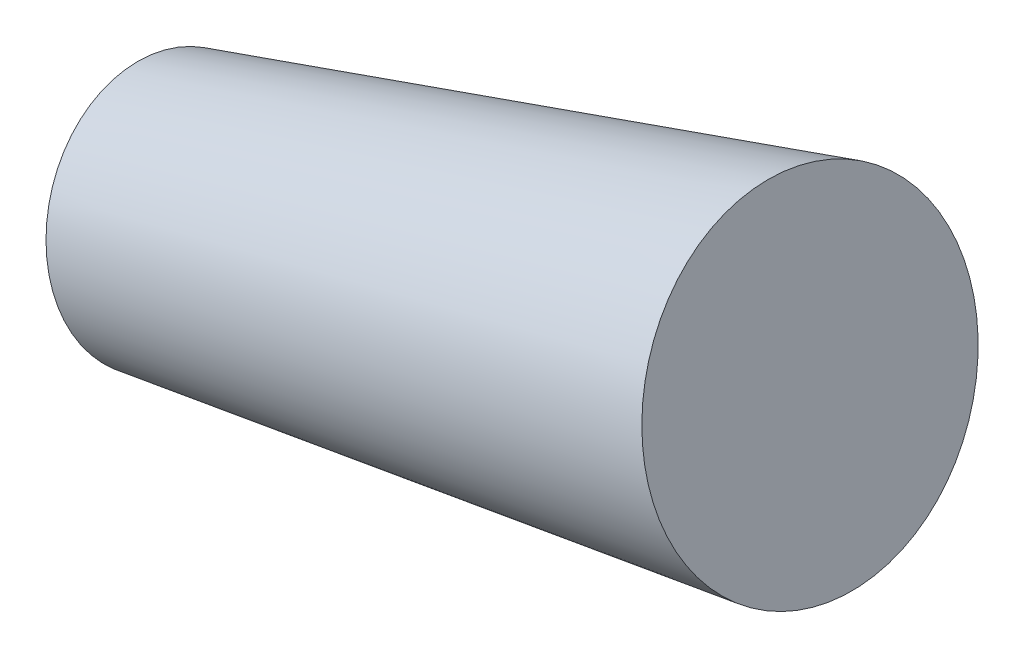
ISO-10303-21;
HEADER;
FILE_DESCRIPTION(('STEP AP214'),'2;1');
FILE_NAME('part.step','',(''),(''),'','','');
FILE_SCHEMA(('AUTOMOTIVE_DESIGN { 1 0 10303 214 1 1 1 1 }'));
ENDSEC;
DATA;
#1=APPLICATION_CONTEXT('core data for automotive mechanical design processes');
#2=APPLICATION_PROTOCOL_DEFINITION('international standard','automotive_design',2000,#1);
#3=PRODUCT_CONTEXT('',#1,'mechanical');
#4=PRODUCT('Part','Part','',(#3));
#5=PRODUCT_RELATED_PRODUCT_CATEGORY('part','',(#4));
#6=PRODUCT_DEFINITION_FORMATION('','',#4);
#7=PRODUCT_DEFINITION_CONTEXT('part definition',#1,'design');
#8=PRODUCT_DEFINITION('design','',#6,#7);
#9=PRODUCT_DEFINITION_SHAPE('','',#8);
#10=(LENGTH_UNIT() NAMED_UNIT(*) SI_UNIT(.MILLI.,.METRE.));
#11=(NAMED_UNIT(*) PLANE_ANGLE_UNIT() SI_UNIT($,.RADIAN.));
#12=(NAMED_UNIT(*) SI_UNIT($,.STERADIAN.) SOLID_ANGLE_UNIT());
#13=UNCERTAINTY_MEASURE_WITH_UNIT(LENGTH_MEASURE(1.E-05),#10,'distance_accuracy_value','');
#14=(GEOMETRIC_REPRESENTATION_CONTEXT(3) GLOBAL_UNCERTAINTY_ASSIGNED_CONTEXT((#13)) GLOBAL_UNIT_ASSIGNED_CONTEXT((#10,
#11,#12)) REPRESENTATION_CONTEXT('',''));
#15=CARTESIAN_POINT('',(0.,0.,0.));
#16=DIRECTION('',(0.,0.,1.));
#17=DIRECTION('',(1.,0.,0.));
#18=AXIS2_PLACEMENT_3D('',#15,#16,#17);
#19=CARTESIAN_POINT('',(1.58497450231059,13.2503651033354,0.));
#20=DIRECTION('',(0.966676102056529,0.256002565832445,0.));
#21=DIRECTION('',(-0.256002565832445,0.966676102056529,0.));
#22=AXIS2_PLACEMENT_3D('',#19,#20,#21);
#23=PLANE('',#22);
#24=CARTESIAN_POINT('',(1.09180686975231,15.1125861445006,0.));
#25=DIRECTION('',(0.966676102056528,0.256002565832447,0.));
#26=DIRECTION('',(-0.256002565832447,0.966676102056528,0.));
#27=AXIS2_PLACEMENT_3D('',#24,#25,#26);
#28=CIRCLE('',#27,1.92641675690069);
#29=CARTESIAN_POINT('',(0.598639237123116,16.9748071859977,0.));
#30=VERTEX_POINT('',#29);
#31=EDGE_CURVE('E17',#30,#30,#28,.T.);
#32=ORIENTED_EDGE('',*,*,#31,.F.);
#33=EDGE_LOOP('',(#32));
#34=FACE_BOUND('',#33,.T.);
#35=ADVANCED_FACE('F14',(#34),#23,.F.);
#36=CARTESIAN_POINT('',(11.5319087719787,17.8774138554952,0.));
#37=DIRECTION('',(-0.966676102056529,-0.256002565832445,0.));
#38=DIRECTION('',(0.256002565832445,-0.966676102056529,0.));
#39=AXIS2_PLACEMENT_3D('',#36,#37,#38);
#40=PLANE('',#39);
#41=CARTESIAN_POINT('',(11.5319087719845,17.8774138554967,0.));
#42=DIRECTION('',(0.966676102056528,0.256002565832447,0.));
#43=DIRECTION('',(-0.256002565832447,0.966676102056528,0.));
#44=AXIS2_PLACEMENT_3D('',#41,#42,#43);
#45=CIRCLE('',#44,2.65000000001762);
#46=CARTESIAN_POINT('',(10.853501972524,20.4391055259636,0.));
#47=VERTEX_POINT('',#46);
#48=EDGE_CURVE('E10',#47,#47,#45,.F.);
#49=ORIENTED_EDGE('',*,*,#48,.F.);
#50=EDGE_LOOP('',(#49));
#51=FACE_BOUND('',#50,.T.);
#52=ADVANCED_FACE('F29',(#51),#40,.F.);
#53=CARTESIAN_POINT('',(11.5319087718642,17.8774138554649,0.));
#54=DIRECTION('',(0.966676102056528,0.256002565832447,0.));
#55=DIRECTION('',(-0.256002565832447,0.966676102056528,0.));
#56=AXIS2_PLACEMENT_3D('',#53,#54,#55);
#57=CONICAL_SURFACE('',#56,2.65000000000928,0.0668984701991793);
#58=ORIENTED_EDGE('',*,*,#48,.T.);
#59=EDGE_LOOP('',(#58));
#60=FACE_BOUND('',#59,.T.);
#61=ORIENTED_EDGE('',*,*,#31,.T.);
#62=EDGE_LOOP('',(#61));
#63=FACE_BOUND('',#62,.T.);
#64=ADVANCED_FACE('F26',(#60,#63),#57,.T.);
#65=CLOSED_SHELL('',(#35,#52,#64));
#66=MANIFOLD_SOLID_BREP('B1',#65);
#67=ADVANCED_BREP_SHAPE_REPRESENTATION('',(#18,#66),#14);
#68=SHAPE_DEFINITION_REPRESENTATION(#9,#67);
ENDSEC;
END-ISO-10303-21;
